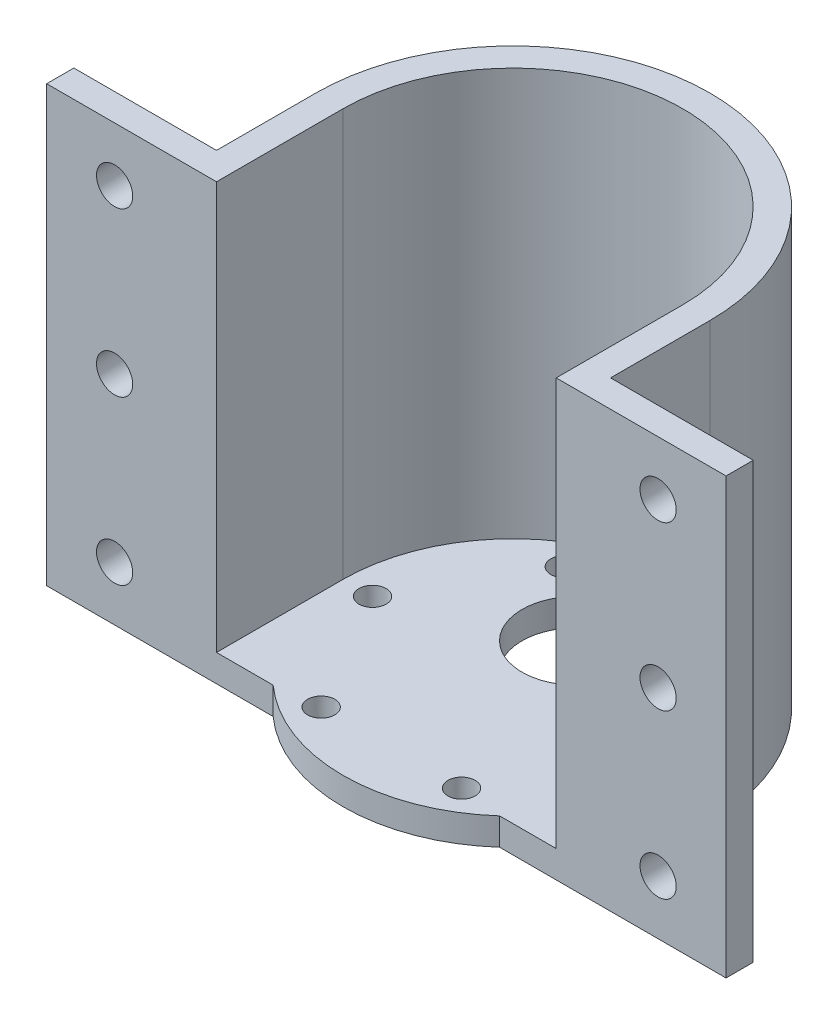
ISO-10303-21;
HEADER;
FILE_DESCRIPTION(('STEP AP214'),'2;1');
FILE_NAME('part.step','',(''),(''),'','','');
FILE_SCHEMA(('AUTOMOTIVE_DESIGN { 1 0 10303 214 1 1 1 1 }'));
ENDSEC;
DATA;
#1=APPLICATION_CONTEXT('core data for automotive mechanical design processes');
#2=APPLICATION_PROTOCOL_DEFINITION('international standard','automotive_design',2000,#1);
#3=PRODUCT_CONTEXT('',#1,'mechanical');
#4=PRODUCT('Part','Part','',(#3));
#5=PRODUCT_RELATED_PRODUCT_CATEGORY('part','',(#4));
#6=PRODUCT_DEFINITION_FORMATION('','',#4);
#7=PRODUCT_DEFINITION_CONTEXT('part definition',#1,'design');
#8=PRODUCT_DEFINITION('design','',#6,#7);
#9=PRODUCT_DEFINITION_SHAPE('','',#8);
#10=(LENGTH_UNIT() NAMED_UNIT(*) SI_UNIT(.MILLI.,.METRE.));
#11=(NAMED_UNIT(*) PLANE_ANGLE_UNIT() SI_UNIT($,.RADIAN.));
#12=(NAMED_UNIT(*) SI_UNIT($,.STERADIAN.) SOLID_ANGLE_UNIT());
#13=UNCERTAINTY_MEASURE_WITH_UNIT(LENGTH_MEASURE(1.E-05),#10,'distance_accuracy_value','');
#14=(GEOMETRIC_REPRESENTATION_CONTEXT(3) GLOBAL_UNCERTAINTY_ASSIGNED_CONTEXT((#13)) GLOBAL_UNIT_ASSIGNED_CONTEXT((#10,
#11,#12)) REPRESENTATION_CONTEXT('',''));
#15=CARTESIAN_POINT('',(0.,0.,0.));
#16=DIRECTION('',(0.,0.,1.));
#17=DIRECTION('',(1.,0.,0.));
#18=AXIS2_PLACEMENT_3D('',#15,#16,#17);
#19=CARTESIAN_POINT('',(-12.5,48.,0.));
#20=DIRECTION('',(0.,0.,-1.));
#21=DIRECTION('',(-1.,0.,0.));
#22=AXIS2_PLACEMENT_3D('',#19,#20,#21);
#23=PLANE('',#22);
#24=CARTESIAN_POINT('',(-30.,6.,0.));
#25=DIRECTION('',(0.,0.,-1.));
#26=DIRECTION('',(-1.,0.,0.));
#27=AXIS2_PLACEMENT_3D('',#24,#25,#26);
#28=CIRCLE('',#27,2.);
#29=CARTESIAN_POINT('',(-32.,6.,0.));
#30=VERTEX_POINT('',#29);
#31=EDGE_CURVE('E291',#30,#30,#28,.T.);
#32=ORIENTED_EDGE('',*,*,#31,.T.);
#33=EDGE_LOOP('',(#32));
#34=FACE_BOUND('',#33,.T.);
#35=CARTESIAN_POINT('',(-30.,24.,0.));
#36=DIRECTION('',(0.,0.,-1.));
#37=DIRECTION('',(-1.,0.,0.));
#38=AXIS2_PLACEMENT_3D('',#35,#36,#37);
#39=CIRCLE('',#38,2.);
#40=CARTESIAN_POINT('',(-32.,24.,0.));
#41=VERTEX_POINT('',#40);
#42=EDGE_CURVE('E295',#41,#41,#39,.T.);
#43=ORIENTED_EDGE('',*,*,#42,.T.);
#44=EDGE_LOOP('',(#43));
#45=FACE_BOUND('',#44,.T.);
#46=CARTESIAN_POINT('',(-30.,42.,0.));
#47=DIRECTION('',(0.,0.,-1.));
#48=DIRECTION('',(-1.,0.,0.));
#49=AXIS2_PLACEMENT_3D('',#46,#47,#48);
#50=CIRCLE('',#49,2.);
#51=CARTESIAN_POINT('',(-32.,42.,0.));
#52=VERTEX_POINT('',#51);
#53=EDGE_CURVE('E298',#52,#52,#50,.T.);
#54=ORIENTED_EDGE('',*,*,#53,.T.);
#55=EDGE_LOOP('',(#54));
#56=FACE_BOUND('',#55,.T.);
#57=DIRECTION('',(0.,-1.,0.));
#58=VECTOR('',#57,1.);
#59=CARTESIAN_POINT('',(-18.75,230.278179267603,0.));
#60=LINE('',#59,#58);
#61=CARTESIAN_POINT('',(-18.75,48.,0.));
#62=VERTEX_POINT('',#61);
#63=CARTESIAN_POINT('',(-18.75,3.,0.));
#64=VERTEX_POINT('',#63);
#65=EDGE_CURVE('E166',#62,#64,#60,.T.);
#66=ORIENTED_EDGE('',*,*,#65,.F.);
#67=DIRECTION('',(1.,0.,0.));
#68=VECTOR('',#67,1.);
#69=CARTESIAN_POINT('',(-12.5,48.,0.));
#70=LINE('',#69,#68);
#71=CARTESIAN_POINT('',(-37.5,48.,0.));
#72=VERTEX_POINT('',#71);
#73=EDGE_CURVE('E146',#72,#62,#70,.T.);
#74=ORIENTED_EDGE('',*,*,#73,.F.);
#75=DIRECTION('',(0.,-1.,0.));
#76=VECTOR('',#75,1.);
#77=CARTESIAN_POINT('',(-37.5,48.,0.));
#78=LINE('',#77,#76);
#79=CARTESIAN_POINT('',(-37.5,0.,0.));
#80=VERTEX_POINT('',#79);
#81=EDGE_CURVE('E196',#72,#80,#78,.T.);
#82=ORIENTED_EDGE('',*,*,#81,.T.);
#83=DIRECTION('',(1.,0.,0.));
#84=VECTOR('',#83,1.);
#85=CARTESIAN_POINT('',(-12.5,0.,0.));
#86=LINE('',#85,#84);
#87=CARTESIAN_POINT('',(-12.5,0.,0.));
#88=VERTEX_POINT('',#87);
#89=EDGE_CURVE('E165',#80,#88,#86,.T.);
#90=ORIENTED_EDGE('',*,*,#89,.T.);
#91=DIRECTION('',(0.,-1.,0.));
#92=VECTOR('',#91,1.);
#93=CARTESIAN_POINT('',(-12.5,48.,0.));
#94=LINE('',#93,#92);
#95=CARTESIAN_POINT('',(-12.5,3.,0.));
#96=VERTEX_POINT('',#95);
#97=EDGE_CURVE('E11',#96,#88,#94,.T.);
#98=ORIENTED_EDGE('',*,*,#97,.F.);
#99=DIRECTION('',(1.,0.,0.));
#100=VECTOR('',#99,1.);
#101=CARTESIAN_POINT('',(-12.5,3.,0.));
#102=LINE('',#101,#100);
#103=EDGE_CURVE('E53',#64,#96,#102,.T.);
#104=ORIENTED_EDGE('',*,*,#103,.F.);
#105=EDGE_LOOP('',(#66,#74,#82,#90,#98,#104));
#106=FACE_BOUND('',#105,.T.);
#107=ADVANCED_FACE('F37',(#34,#45,#56,#106),#23,.F.);
#108=CARTESIAN_POINT('',(0.,48.,-13.9754248593737));
#109=DIRECTION('',(0.,-1.,0.));
#110=DIRECTION('',(0.,0.,-1.));
#111=AXIS2_PLACEMENT_3D('',#108,#109,#110);
#112=CYLINDRICAL_SURFACE('',#111,18.75);
#113=CARTESIAN_POINT('',(0.,3.,-13.9754248593737));
#114=DIRECTION('',(0.,1.,0.));
#115=DIRECTION('',(0.,0.,1.));
#116=AXIS2_PLACEMENT_3D('',#113,#114,#115);
#117=CIRCLE('',#116,18.75);
#118=CARTESIAN_POINT('',(12.5,3.,0.));
#119=VERTEX_POINT('',#118);
#120=EDGE_CURVE('E175',#96,#119,#117,.T.);
#121=ORIENTED_EDGE('',*,*,#120,.F.);
#122=ORIENTED_EDGE('',*,*,#97,.T.);
#123=CARTESIAN_POINT('',(0.,0.,-13.9754248593737));
#124=DIRECTION('',(0.,1.,0.));
#125=DIRECTION('',(0.,0.,1.));
#126=AXIS2_PLACEMENT_3D('',#123,#124,#125);
#127=CIRCLE('',#126,18.75);
#128=CARTESIAN_POINT('',(12.5,0.,0.));
#129=VERTEX_POINT('',#128);
#130=EDGE_CURVE('E169',#88,#129,#127,.T.);
#131=ORIENTED_EDGE('',*,*,#130,.T.);
#132=DIRECTION('',(0.,-1.,0.));
#133=VECTOR('',#132,1.);
#134=CARTESIAN_POINT('',(12.5,48.,0.));
#135=LINE('',#134,#133);
#136=EDGE_CURVE('E45',#119,#129,#135,.T.);
#137=ORIENTED_EDGE('',*,*,#136,.F.);
#138=EDGE_LOOP('',(#121,#122,#131,#137));
#139=FACE_BOUND('',#138,.T.);
#140=ADVANCED_FACE('F282',(#139),#112,.T.);
#141=CARTESIAN_POINT('',(0.,48.,-13.9754248593737));
#142=DIRECTION('',(0.,-1.,0.));
#143=DIRECTION('',(0.,0.,-1.));
#144=AXIS2_PLACEMENT_3D('',#141,#142,#143);
#145=PLANE('',#144);
#146=ORIENTED_EDGE('',*,*,#73,.T.);
#147=DIRECTION('',(0.,0.,-1.));
#148=VECTOR('',#147,1.);
#149=CARTESIAN_POINT('',(-18.75,48.,-13.9754248593737));
#150=LINE('',#149,#148);
#151=CARTESIAN_POINT('',(-18.75,48.,-13.9754248593737));
#152=VERTEX_POINT('',#151);
#153=EDGE_CURVE('E140',#62,#152,#150,.T.);
#154=ORIENTED_EDGE('',*,*,#153,.T.);
#155=CARTESIAN_POINT('',(0.,48.,-13.9754248593737));
#156=DIRECTION('',(0.,-1.,0.));
#157=DIRECTION('',(0.,0.,-1.));
#158=AXIS2_PLACEMENT_3D('',#155,#156,#157);
#159=CIRCLE('',#158,18.75);
#160=CARTESIAN_POINT('',(18.75,48.,-13.9754248593737));
#161=VERTEX_POINT('',#160);
#162=EDGE_CURVE('E143',#152,#161,#159,.T.);
#163=ORIENTED_EDGE('',*,*,#162,.T.);
#164=DIRECTION('',(0.,0.,1.));
#165=VECTOR('',#164,1.);
#166=CARTESIAN_POINT('',(18.75,48.,-13.9754248593737));
#167=LINE('',#166,#165);
#168=CARTESIAN_POINT('',(18.75,48.,0.));
#169=VERTEX_POINT('',#168);
#170=EDGE_CURVE('E160',#161,#169,#167,.T.);
#171=ORIENTED_EDGE('',*,*,#170,.T.);
#172=DIRECTION('',(1.,0.,0.));
#173=VECTOR('',#172,1.);
#174=CARTESIAN_POINT('',(37.5,48.,0.));
#175=LINE('',#174,#173);
#176=CARTESIAN_POINT('',(37.5,48.,0.));
#177=VERTEX_POINT('',#176);
#178=EDGE_CURVE('E180',#169,#177,#175,.T.);
#179=ORIENTED_EDGE('',*,*,#178,.T.);
#180=DIRECTION('',(0.,0.,-1.));
#181=VECTOR('',#180,1.);
#182=CARTESIAN_POINT('',(37.5,48.,0.));
#183=LINE('',#182,#181);
#184=CARTESIAN_POINT('',(37.5,48.,-2.99999999999999));
#185=VERTEX_POINT('',#184);
#186=EDGE_CURVE('E183',#177,#185,#183,.T.);
#187=ORIENTED_EDGE('',*,*,#186,.T.);
#188=DIRECTION('',(-1.,0.,0.));
#189=VECTOR('',#188,1.);
#190=CARTESIAN_POINT('',(37.5,48.,-2.99999999999999));
#191=LINE('',#190,#189);
#192=CARTESIAN_POINT('',(21.75,48.,-2.99999999999999));
#193=VERTEX_POINT('',#192);
#194=EDGE_CURVE('E185',#185,#193,#191,.T.);
#195=ORIENTED_EDGE('',*,*,#194,.T.);
#196=DIRECTION('',(0.,0.,-1.));
#197=VECTOR('',#196,1.);
#198=CARTESIAN_POINT('',(21.75,48.,-2.99999999999999));
#199=LINE('',#198,#197);
#200=CARTESIAN_POINT('',(21.75,48.,-13.9754248593737));
#201=VERTEX_POINT('',#200);
#202=EDGE_CURVE('E187',#193,#201,#199,.T.);
#203=ORIENTED_EDGE('',*,*,#202,.T.);
#204=CARTESIAN_POINT('',(0.,48.,-13.9754248593737));
#205=DIRECTION('',(0.,1.,0.));
#206=DIRECTION('',(0.,0.,-1.));
#207=AXIS2_PLACEMENT_3D('',#204,#205,#206);
#208=CIRCLE('',#207,21.75);
#209=CARTESIAN_POINT('',(-21.75,48.,-13.9754248593737));
#210=VERTEX_POINT('',#209);
#211=EDGE_CURVE('E189',#201,#210,#208,.T.);
#212=ORIENTED_EDGE('',*,*,#211,.T.);
#213=DIRECTION('',(0.,0.,1.));
#214=VECTOR('',#213,1.);
#215=CARTESIAN_POINT('',(-21.75,48.,-2.99999999999999));
#216=LINE('',#215,#214);
#217=CARTESIAN_POINT('',(-21.75,48.,-2.99999999999999));
#218=VERTEX_POINT('',#217);
#219=EDGE_CURVE('E191',#210,#218,#216,.T.);
#220=ORIENTED_EDGE('',*,*,#219,.T.);
#221=DIRECTION('',(-1.,0.,0.));
#222=VECTOR('',#221,1.);
#223=CARTESIAN_POINT('',(-37.5,48.,-2.99999999999999));
#224=LINE('',#223,#222);
#225=CARTESIAN_POINT('',(-37.5,48.,-2.99999999999999));
#226=VERTEX_POINT('',#225);
#227=EDGE_CURVE('E193',#218,#226,#224,.T.);
#228=ORIENTED_EDGE('',*,*,#227,.T.);
#229=DIRECTION('',(0.,0.,1.));
#230=VECTOR('',#229,1.);
#231=CARTESIAN_POINT('',(-37.5,48.,0.));
#232=LINE('',#231,#230);
#233=EDGE_CURVE('E195',#226,#72,#232,.T.);
#234=ORIENTED_EDGE('',*,*,#233,.T.);
#235=EDGE_LOOP('',(#146,#154,#163,#171,#179,#187,#195,#203,#212,#220,#228,#234));
#236=FACE_BOUND('',#235,.T.);
#237=ADVANCED_FACE('F142',(#236),#145,.F.);
#238=CARTESIAN_POINT('',(37.5,48.,0.));
#239=DIRECTION('',(0.,0.,-1.));
#240=DIRECTION('',(-1.,0.,0.));
#241=AXIS2_PLACEMENT_3D('',#238,#239,#240);
#242=PLANE('',#241);
#243=CARTESIAN_POINT('',(30.,24.,0.));
#244=DIRECTION('',(0.,0.,-1.));
#245=DIRECTION('',(-1.,0.,0.));
#246=AXIS2_PLACEMENT_3D('',#243,#244,#245);
#247=CIRCLE('',#246,2.);
#248=CARTESIAN_POINT('',(28.,24.,0.));
#249=VERTEX_POINT('',#248);
#250=EDGE_CURVE('E386',#249,#249,#247,.T.);
#251=ORIENTED_EDGE('',*,*,#250,.T.);
#252=EDGE_LOOP('',(#251));
#253=FACE_BOUND('',#252,.T.);
#254=CARTESIAN_POINT('',(30.,42.,0.));
#255=DIRECTION('',(0.,0.,-1.));
#256=DIRECTION('',(-1.,0.,0.));
#257=AXIS2_PLACEMENT_3D('',#254,#255,#256);
#258=CIRCLE('',#257,2.);
#259=CARTESIAN_POINT('',(28.,42.,0.));
#260=VERTEX_POINT('',#259);
#261=EDGE_CURVE('E390',#260,#260,#258,.T.);
#262=ORIENTED_EDGE('',*,*,#261,.T.);
#263=EDGE_LOOP('',(#262));
#264=FACE_BOUND('',#263,.T.);
#265=CARTESIAN_POINT('',(30.,6.,0.));
#266=DIRECTION('',(0.,0.,-1.));
#267=DIRECTION('',(-1.,0.,0.));
#268=AXIS2_PLACEMENT_3D('',#265,#266,#267);
#269=CIRCLE('',#268,2.);
#270=CARTESIAN_POINT('',(28.,6.,0.));
#271=VERTEX_POINT('',#270);
#272=EDGE_CURVE('E393',#271,#271,#269,.T.);
#273=ORIENTED_EDGE('',*,*,#272,.T.);
#274=EDGE_LOOP('',(#273));
#275=FACE_BOUND('',#274,.T.);
#276=ORIENTED_EDGE('',*,*,#178,.F.);
#277=DIRECTION('',(0.,-1.,0.));
#278=VECTOR('',#277,1.);
#279=CARTESIAN_POINT('',(18.75,230.278179267603,0.));
#280=LINE('',#279,#278);
#281=CARTESIAN_POINT('',(18.75,3.,0.));
#282=VERTEX_POINT('',#281);
#283=EDGE_CURVE('E61',#169,#282,#280,.T.);
#284=ORIENTED_EDGE('',*,*,#283,.T.);
#285=DIRECTION('',(1.,0.,0.));
#286=VECTOR('',#285,1.);
#287=CARTESIAN_POINT('',(37.5,3.,0.));
#288=LINE('',#287,#286);
#289=EDGE_CURVE('E150',#119,#282,#288,.T.);
#290=ORIENTED_EDGE('',*,*,#289,.F.);
#291=ORIENTED_EDGE('',*,*,#136,.T.);
#292=DIRECTION('',(1.,0.,0.));
#293=VECTOR('',#292,1.);
#294=CARTESIAN_POINT('',(37.5,0.,0.));
#295=LINE('',#294,#293);
#296=CARTESIAN_POINT('',(37.5,0.,0.));
#297=VERTEX_POINT('',#296);
#298=EDGE_CURVE('E200',#129,#297,#295,.T.);
#299=ORIENTED_EDGE('',*,*,#298,.T.);
#300=DIRECTION('',(0.,-1.,0.));
#301=VECTOR('',#300,1.);
#302=CARTESIAN_POINT('',(37.5,48.,0.));
#303=LINE('',#302,#301);
#304=EDGE_CURVE('E235',#177,#297,#303,.T.);
#305=ORIENTED_EDGE('',*,*,#304,.F.);
#306=EDGE_LOOP('',(#276,#284,#290,#291,#299,#305));
#307=FACE_BOUND('',#306,.T.);
#308=ADVANCED_FACE('F325',(#253,#264,#275,#307),#242,.F.);
#309=CARTESIAN_POINT('',(37.5,48.,0.));
#310=DIRECTION('',(-1.,0.,0.));
#311=DIRECTION('',(0.,0.,1.));
#312=AXIS2_PLACEMENT_3D('',#309,#310,#311);
#313=PLANE('',#312);
#314=DIRECTION('',(0.,0.,-1.));
#315=VECTOR('',#314,1.);
#316=CARTESIAN_POINT('',(37.5,0.,0.));
#317=LINE('',#316,#315);
#318=CARTESIAN_POINT('',(37.5,0.,-2.99999999999999));
#319=VERTEX_POINT('',#318);
#320=EDGE_CURVE('E202',#297,#319,#317,.T.);
#321=ORIENTED_EDGE('',*,*,#320,.T.);
#322=DIRECTION('',(0.,-1.,0.));
#323=VECTOR('',#322,1.);
#324=CARTESIAN_POINT('',(37.5,48.,-2.99999999999999));
#325=LINE('',#324,#323);
#326=EDGE_CURVE('E232',#185,#319,#325,.T.);
#327=ORIENTED_EDGE('',*,*,#326,.F.);
#328=ORIENTED_EDGE('',*,*,#186,.F.);
#329=ORIENTED_EDGE('',*,*,#304,.T.);
#330=EDGE_LOOP('',(#321,#327,#328,#329));
#331=FACE_BOUND('',#330,.T.);
#332=ADVANCED_FACE('F329',(#331),#313,.F.);
#333=CARTESIAN_POINT('',(37.5,48.,-2.99999999999999));
#334=DIRECTION('',(0.,0.,1.));
#335=DIRECTION('',(1.,0.,0.));
#336=AXIS2_PLACEMENT_3D('',#333,#334,#335);
#337=PLANE('',#336);
#338=CARTESIAN_POINT('',(30.,24.,-2.99999999999999));
#339=DIRECTION('',(0.,0.,-1.));
#340=DIRECTION('',(-1.,0.,0.));
#341=AXIS2_PLACEMENT_3D('',#338,#339,#340);
#342=CIRCLE('',#341,2.);
#343=CARTESIAN_POINT('',(28.,24.,-2.99999999999999));
#344=VERTEX_POINT('',#343);
#345=EDGE_CURVE('E705',#344,#344,#342,.T.);
#346=ORIENTED_EDGE('',*,*,#345,.F.);
#347=EDGE_LOOP('',(#346));
#348=FACE_BOUND('',#347,.T.);
#349=CARTESIAN_POINT('',(30.,42.,-2.99999999999999));
#350=DIRECTION('',(0.,0.,-1.));
#351=DIRECTION('',(-1.,0.,0.));
#352=AXIS2_PLACEMENT_3D('',#349,#350,#351);
#353=CIRCLE('',#352,2.);
#354=CARTESIAN_POINT('',(28.,42.,-2.99999999999999));
#355=VERTEX_POINT('',#354);
#356=EDGE_CURVE('E707',#355,#355,#353,.T.);
#357=ORIENTED_EDGE('',*,*,#356,.F.);
#358=EDGE_LOOP('',(#357));
#359=FACE_BOUND('',#358,.T.);
#360=CARTESIAN_POINT('',(30.,6.,-2.99999999999999));
#361=DIRECTION('',(0.,0.,-1.));
#362=DIRECTION('',(-1.,0.,0.));
#363=AXIS2_PLACEMENT_3D('',#360,#361,#362);
#364=CIRCLE('',#363,2.);
#365=CARTESIAN_POINT('',(28.,6.,-2.99999999999999));
#366=VERTEX_POINT('',#365);
#367=EDGE_CURVE('E706',#366,#366,#364,.T.);
#368=ORIENTED_EDGE('',*,*,#367,.F.);
#369=EDGE_LOOP('',(#368));
#370=FACE_BOUND('',#369,.T.);
#371=DIRECTION('',(-1.,0.,0.));
#372=VECTOR('',#371,1.);
#373=CARTESIAN_POINT('',(37.5,0.,-2.99999999999999));
#374=LINE('',#373,#372);
#375=CARTESIAN_POINT('',(21.75,0.,-2.99999999999999));
#376=VERTEX_POINT('',#375);
#377=EDGE_CURVE('E204',#319,#376,#374,.T.);
#378=ORIENTED_EDGE('',*,*,#377,.T.);
#379=DIRECTION('',(0.,-1.,0.));
#380=VECTOR('',#379,1.);
#381=CARTESIAN_POINT('',(21.75,48.,-2.99999999999999));
#382=LINE('',#381,#380);
#383=EDGE_CURVE('E229',#193,#376,#382,.T.);
#384=ORIENTED_EDGE('',*,*,#383,.F.);
#385=ORIENTED_EDGE('',*,*,#194,.F.);
#386=ORIENTED_EDGE('',*,*,#326,.T.);
#387=EDGE_LOOP('',(#378,#384,#385,#386));
#388=FACE_BOUND('',#387,.T.);
#389=ADVANCED_FACE('F335',(#348,#359,#370,#388),#337,.F.);
#390=CARTESIAN_POINT('',(21.75,48.,-2.99999999999999));
#391=DIRECTION('',(-1.,0.,0.));
#392=DIRECTION('',(0.,0.,1.));
#393=AXIS2_PLACEMENT_3D('',#390,#391,#392);
#394=PLANE('',#393);
#395=DIRECTION('',(0.,0.,-1.));
#396=VECTOR('',#395,1.);
#397=CARTESIAN_POINT('',(21.75,0.,-2.99999999999999));
#398=LINE('',#397,#396);
#399=CARTESIAN_POINT('',(21.75,0.,-13.9754248593737));
#400=VERTEX_POINT('',#399);
#401=EDGE_CURVE('E206',#376,#400,#398,.T.);
#402=ORIENTED_EDGE('',*,*,#401,.T.);
#403=DIRECTION('',(0.,-1.,0.));
#404=VECTOR('',#403,1.);
#405=CARTESIAN_POINT('',(21.75,48.,-13.9754248593737));
#406=LINE('',#405,#404);
#407=EDGE_CURVE('E226',#201,#400,#406,.T.);
#408=ORIENTED_EDGE('',*,*,#407,.F.);
#409=ORIENTED_EDGE('',*,*,#202,.F.);
#410=ORIENTED_EDGE('',*,*,#383,.T.);
#411=EDGE_LOOP('',(#402,#408,#409,#410));
#412=FACE_BOUND('',#411,.T.);
#413=ADVANCED_FACE('F339',(#412),#394,.F.);
#414=CARTESIAN_POINT('',(0.,48.,-13.9754248593737));
#415=DIRECTION('',(0.,-1.,0.));
#416=DIRECTION('',(0.,0.,-1.));
#417=AXIS2_PLACEMENT_3D('',#414,#415,#416);
#418=CYLINDRICAL_SURFACE('',#417,21.75);
#419=CARTESIAN_POINT('',(0.,0.,-13.9754248593737));
#420=DIRECTION('',(0.,1.,0.));
#421=DIRECTION('',(0.,0.,-1.));
#422=AXIS2_PLACEMENT_3D('',#419,#420,#421);
#423=CIRCLE('',#422,21.75);
#424=CARTESIAN_POINT('',(-21.75,0.,-13.9754248593737));
#425=VERTEX_POINT('',#424);
#426=EDGE_CURVE('E208',#400,#425,#423,.T.);
#427=ORIENTED_EDGE('',*,*,#426,.T.);
#428=DIRECTION('',(0.,-1.,0.));
#429=VECTOR('',#428,1.);
#430=CARTESIAN_POINT('',(-21.75,48.,-13.9754248593737));
#431=LINE('',#430,#429);
#432=EDGE_CURVE('E223',#210,#425,#431,.T.);
#433=ORIENTED_EDGE('',*,*,#432,.F.);
#434=ORIENTED_EDGE('',*,*,#211,.F.);
#435=ORIENTED_EDGE('',*,*,#407,.T.);
#436=EDGE_LOOP('',(#427,#433,#434,#435));
#437=FACE_BOUND('',#436,.T.);
#438=ADVANCED_FACE('F344',(#437),#418,.T.);
#439=CARTESIAN_POINT('',(-21.75,48.,-2.99999999999999));
#440=DIRECTION('',(1.,0.,0.));
#441=DIRECTION('',(0.,0.,-1.));
#442=AXIS2_PLACEMENT_3D('',#439,#440,#441);
#443=PLANE('',#442);
#444=DIRECTION('',(0.,0.,1.));
#445=VECTOR('',#444,1.);
#446=CARTESIAN_POINT('',(-21.75,0.,-2.99999999999999));
#447=LINE('',#446,#445);
#448=CARTESIAN_POINT('',(-21.75,0.,-2.99999999999999));
#449=VERTEX_POINT('',#448);
#450=EDGE_CURVE('E210',#425,#449,#447,.T.);
#451=ORIENTED_EDGE('',*,*,#450,.T.);
#452=DIRECTION('',(0.,-1.,0.));
#453=VECTOR('',#452,1.);
#454=CARTESIAN_POINT('',(-21.75,48.,-2.99999999999999));
#455=LINE('',#454,#453);
#456=EDGE_CURVE('E220',#218,#449,#455,.T.);
#457=ORIENTED_EDGE('',*,*,#456,.F.);
#458=ORIENTED_EDGE('',*,*,#219,.F.);
#459=ORIENTED_EDGE('',*,*,#432,.T.);
#460=EDGE_LOOP('',(#451,#457,#458,#459));
#461=FACE_BOUND('',#460,.T.);
#462=ADVANCED_FACE('F350',(#461),#443,.F.);
#463=CARTESIAN_POINT('',(-37.5,48.,-2.99999999999999));
#464=DIRECTION('',(0.,0.,1.));
#465=DIRECTION('',(1.,0.,0.));
#466=AXIS2_PLACEMENT_3D('',#463,#464,#465);
#467=PLANE('',#466);
#468=CARTESIAN_POINT('',(-30.,6.,-2.99999999999999));
#469=DIRECTION('',(0.,0.,-1.));
#470=DIRECTION('',(1.,0.,0.));
#471=AXIS2_PLACEMENT_3D('',#468,#469,#470);
#472=CIRCLE('',#471,2.);
#473=CARTESIAN_POINT('',(-28.,6.,-2.99999999999999));
#474=VERTEX_POINT('',#473);
#475=EDGE_CURVE('E712',#474,#474,#472,.T.);
#476=ORIENTED_EDGE('',*,*,#475,.F.);
#477=EDGE_LOOP('',(#476));
#478=FACE_BOUND('',#477,.T.);
#479=CARTESIAN_POINT('',(-30.,24.,-2.99999999999999));
#480=DIRECTION('',(0.,0.,-1.));
#481=DIRECTION('',(1.,0.,0.));
#482=AXIS2_PLACEMENT_3D('',#479,#480,#481);
#483=CIRCLE('',#482,2.);
#484=CARTESIAN_POINT('',(-28.,24.,-2.99999999999999));
#485=VERTEX_POINT('',#484);
#486=EDGE_CURVE('E719',#485,#485,#483,.T.);
#487=ORIENTED_EDGE('',*,*,#486,.F.);
#488=EDGE_LOOP('',(#487));
#489=FACE_BOUND('',#488,.T.);
#490=CARTESIAN_POINT('',(-30.,42.,-2.99999999999999));
#491=DIRECTION('',(0.,0.,-1.));
#492=DIRECTION('',(1.,0.,0.));
#493=AXIS2_PLACEMENT_3D('',#490,#491,#492);
#494=CIRCLE('',#493,2.);
#495=CARTESIAN_POINT('',(-28.,42.,-2.99999999999999));
#496=VERTEX_POINT('',#495);
#497=EDGE_CURVE('E715',#496,#496,#494,.T.);
#498=ORIENTED_EDGE('',*,*,#497,.F.);
#499=EDGE_LOOP('',(#498));
#500=FACE_BOUND('',#499,.T.);
#501=DIRECTION('',(-1.,0.,0.));
#502=VECTOR('',#501,1.);
#503=CARTESIAN_POINT('',(-37.5,0.,-2.99999999999999));
#504=LINE('',#503,#502);
#505=CARTESIAN_POINT('',(-37.5,0.,-2.99999999999999));
#506=VERTEX_POINT('',#505);
#507=EDGE_CURVE('E212',#449,#506,#504,.T.);
#508=ORIENTED_EDGE('',*,*,#507,.T.);
#509=DIRECTION('',(0.,-1.,0.));
#510=VECTOR('',#509,1.);
#511=CARTESIAN_POINT('',(-37.5,48.,-2.99999999999999));
#512=LINE('',#511,#510);
#513=EDGE_CURVE('E217',#226,#506,#512,.T.);
#514=ORIENTED_EDGE('',*,*,#513,.F.);
#515=ORIENTED_EDGE('',*,*,#227,.F.);
#516=ORIENTED_EDGE('',*,*,#456,.T.);
#517=EDGE_LOOP('',(#508,#514,#515,#516));
#518=FACE_BOUND('',#517,.T.);
#519=ADVANCED_FACE('F353',(#478,#489,#500,#518),#467,.F.);
#520=CARTESIAN_POINT('',(-37.5,48.,0.));
#521=DIRECTION('',(1.,0.,0.));
#522=DIRECTION('',(0.,0.,-1.));
#523=AXIS2_PLACEMENT_3D('',#520,#521,#522);
#524=PLANE('',#523);
#525=DIRECTION('',(0.,0.,1.));
#526=VECTOR('',#525,1.);
#527=CARTESIAN_POINT('',(-37.5,0.,0.));
#528=LINE('',#527,#526);
#529=EDGE_CURVE('E181',#506,#80,#528,.T.);
#530=ORIENTED_EDGE('',*,*,#529,.T.);
#531=ORIENTED_EDGE('',*,*,#81,.F.);
#532=ORIENTED_EDGE('',*,*,#233,.F.);
#533=ORIENTED_EDGE('',*,*,#513,.T.);
#534=EDGE_LOOP('',(#530,#531,#532,#533));
#535=FACE_BOUND('',#534,.T.);
#536=ADVANCED_FACE('F354',(#535),#524,.F.);
#537=CARTESIAN_POINT('',(0.,0.,-13.9754248593737));
#538=DIRECTION('',(0.,-1.,0.));
#539=DIRECTION('',(0.,0.,-1.));
#540=AXIS2_PLACEMENT_3D('',#537,#538,#539);
#541=PLANE('',#540);
#542=CARTESIAN_POINT('',(7.74999999999999,0.,-0.552031100714875));
#543=DIRECTION('',(0.,-1.,0.));
#544=DIRECTION('',(0.,0.,-1.));
#545=AXIS2_PLACEMENT_3D('',#542,#543,#544);
#546=CIRCLE('',#545,1.5);
#547=CARTESIAN_POINT('',(7.74999999999999,0.,-2.05203110071487));
#548=VERTEX_POINT('',#547);
#549=EDGE_CURVE('E401',#548,#548,#546,.T.);
#550=ORIENTED_EDGE('',*,*,#549,.F.);
#551=EDGE_LOOP('',(#550));
#552=FACE_BOUND('',#551,.T.);
#553=CARTESIAN_POINT('',(-7.75000000000001,0.,-0.552031100714882));
#554=DIRECTION('',(0.,-1.,0.));
#555=DIRECTION('',(0.,0.,-1.));
#556=AXIS2_PLACEMENT_3D('',#553,#554,#555);
#557=CIRCLE('',#556,1.5);
#558=CARTESIAN_POINT('',(-7.75000000000001,0.,-2.05203110071488));
#559=VERTEX_POINT('',#558);
#560=EDGE_CURVE('E414',#559,#559,#557,.T.);
#561=ORIENTED_EDGE('',*,*,#560,.F.);
#562=EDGE_LOOP('',(#561));
#563=FACE_BOUND('',#562,.T.);
#564=CARTESIAN_POINT('',(-15.5,0.,-13.9754248593737));
#565=DIRECTION('',(0.,-1.,0.));
#566=DIRECTION('',(0.,0.,-1.));
#567=AXIS2_PLACEMENT_3D('',#564,#565,#566);
#568=CIRCLE('',#567,1.5);
#569=CARTESIAN_POINT('',(-15.5,0.,-15.4754248593737));
#570=VERTEX_POINT('',#569);
#571=EDGE_CURVE('E411',#570,#570,#568,.T.);
#572=ORIENTED_EDGE('',*,*,#571,.F.);
#573=EDGE_LOOP('',(#572));
#574=FACE_BOUND('',#573,.T.);
#575=CARTESIAN_POINT('',(-7.75,0.,-27.3988186180325));
#576=DIRECTION('',(0.,-1.,0.));
#577=DIRECTION('',(0.,0.,-1.));
#578=AXIS2_PLACEMENT_3D('',#575,#576,#577);
#579=CIRCLE('',#578,1.5);
#580=CARTESIAN_POINT('',(-7.75,0.,-28.8988186180325));
#581=VERTEX_POINT('',#580);
#582=EDGE_CURVE('E408',#581,#581,#579,.T.);
#583=ORIENTED_EDGE('',*,*,#582,.F.);
#584=EDGE_LOOP('',(#583));
#585=FACE_BOUND('',#584,.T.);
#586=CARTESIAN_POINT('',(7.75,0.,-27.3988186180325));
#587=DIRECTION('',(0.,-1.,0.));
#588=DIRECTION('',(0.,0.,-1.));
#589=AXIS2_PLACEMENT_3D('',#586,#587,#588);
#590=CIRCLE('',#589,1.5);
#591=CARTESIAN_POINT('',(7.75,0.,-28.8988186180325));
#592=VERTEX_POINT('',#591);
#593=EDGE_CURVE('E405',#592,#592,#590,.T.);
#594=ORIENTED_EDGE('',*,*,#593,.F.);
#595=EDGE_LOOP('',(#594));
#596=FACE_BOUND('',#595,.T.);
#597=CARTESIAN_POINT('',(15.5,0.,-13.9754248593737));
#598=DIRECTION('',(0.,-1.,0.));
#599=DIRECTION('',(0.,0.,-1.));
#600=AXIS2_PLACEMENT_3D('',#597,#598,#599);
#601=CIRCLE('',#600,1.5);
#602=CARTESIAN_POINT('',(15.5,0.,-15.4754248593737));
#603=VERTEX_POINT('',#602);
#604=EDGE_CURVE('E402',#603,#603,#601,.T.);
#605=ORIENTED_EDGE('',*,*,#604,.F.);
#606=EDGE_LOOP('',(#605));
#607=FACE_BOUND('',#606,.T.);
#608=CARTESIAN_POINT('',(0.,0.,-20.9754248593737));
#609=DIRECTION('',(0.,-1.,0.));
#610=DIRECTION('',(0.,0.,-1.));
#611=AXIS2_PLACEMENT_3D('',#608,#609,#610);
#612=CIRCLE('',#611,6.);
#613=CARTESIAN_POINT('',(0.,0.,-26.9754248593737));
#614=VERTEX_POINT('',#613);
#615=EDGE_CURVE('E243',#614,#614,#612,.T.);
#616=ORIENTED_EDGE('',*,*,#615,.F.);
#617=EDGE_LOOP('',(#616));
#618=FACE_BOUND('',#617,.T.);
#619=ORIENTED_EDGE('',*,*,#89,.F.);
#620=ORIENTED_EDGE('',*,*,#529,.F.);
#621=ORIENTED_EDGE('',*,*,#507,.F.);
#622=ORIENTED_EDGE('',*,*,#450,.F.);
#623=ORIENTED_EDGE('',*,*,#426,.F.);
#624=ORIENTED_EDGE('',*,*,#401,.F.);
#625=ORIENTED_EDGE('',*,*,#377,.F.);
#626=ORIENTED_EDGE('',*,*,#320,.F.);
#627=ORIENTED_EDGE('',*,*,#298,.F.);
#628=ORIENTED_EDGE('',*,*,#130,.F.);
#629=EDGE_LOOP('',(#619,#620,#621,#622,#623,#624,#625,#626,#627,#628));
#630=FACE_BOUND('',#629,.T.);
#631=ADVANCED_FACE('F306',(#552,#563,#574,#585,#596,#607,#618,#630),#541,.T.);
#632=CARTESIAN_POINT('',(-18.75,230.278179267603,-13.9754248593737));
#633=DIRECTION('',(1.,0.,0.));
#634=DIRECTION('',(0.,0.,-1.));
#635=AXIS2_PLACEMENT_3D('',#632,#633,#634);
#636=PLANE('',#635);
#637=ORIENTED_EDGE('',*,*,#153,.F.);
#638=ORIENTED_EDGE('',*,*,#65,.T.);
#639=DIRECTION('',(0.,0.,-1.));
#640=VECTOR('',#639,1.);
#641=CARTESIAN_POINT('',(-18.75,3.,-13.9754248593737));
#642=LINE('',#641,#640);
#643=CARTESIAN_POINT('',(-18.75,3.,-13.9754248593737));
#644=VERTEX_POINT('',#643);
#645=EDGE_CURVE('E164',#64,#644,#642,.T.);
#646=ORIENTED_EDGE('',*,*,#645,.T.);
#647=DIRECTION('',(0.,-1.,0.));
#648=VECTOR('',#647,1.);
#649=CARTESIAN_POINT('',(-18.75,230.278179267603,-13.9754248593737));
#650=LINE('',#649,#648);
#651=EDGE_CURVE('E157',#152,#644,#650,.T.);
#652=ORIENTED_EDGE('',*,*,#651,.F.);
#653=EDGE_LOOP('',(#637,#638,#646,#652));
#654=FACE_BOUND('',#653,.T.);
#655=ADVANCED_FACE('F163',(#654),#636,.T.);
#656=CARTESIAN_POINT('',(0.,230.278179267603,-13.9754248593737));
#657=DIRECTION('',(0.,-1.,0.));
#658=DIRECTION('',(0.,0.,-1.));
#659=AXIS2_PLACEMENT_3D('',#656,#657,#658);
#660=CYLINDRICAL_SURFACE('',#659,18.75);
#661=ORIENTED_EDGE('',*,*,#162,.F.);
#662=ORIENTED_EDGE('',*,*,#651,.T.);
#663=CARTESIAN_POINT('',(0.,3.,-13.9754248593737));
#664=DIRECTION('',(0.,-1.,0.));
#665=DIRECTION('',(0.,0.,-1.));
#666=AXIS2_PLACEMENT_3D('',#663,#664,#665);
#667=CIRCLE('',#666,18.75);
#668=CARTESIAN_POINT('',(18.75,3.,-13.9754248593737));
#669=VERTEX_POINT('',#668);
#670=EDGE_CURVE('E312',#644,#669,#667,.T.);
#671=ORIENTED_EDGE('',*,*,#670,.T.);
#672=DIRECTION('',(0.,-1.,0.));
#673=VECTOR('',#672,1.);
#674=CARTESIAN_POINT('',(18.75,230.278179267603,-13.9754248593737));
#675=LINE('',#674,#673);
#676=EDGE_CURVE('E159',#161,#669,#675,.T.);
#677=ORIENTED_EDGE('',*,*,#676,.F.);
#678=EDGE_LOOP('',(#661,#662,#671,#677));
#679=FACE_BOUND('',#678,.T.);
#680=ADVANCED_FACE('F155',(#679),#660,.F.);
#681=CARTESIAN_POINT('',(18.75,230.278179267603,-13.9754248593737));
#682=DIRECTION('',(-1.,0.,0.));
#683=DIRECTION('',(0.,0.,1.));
#684=AXIS2_PLACEMENT_3D('',#681,#682,#683);
#685=PLANE('',#684);
#686=ORIENTED_EDGE('',*,*,#170,.F.);
#687=ORIENTED_EDGE('',*,*,#676,.T.);
#688=DIRECTION('',(0.,0.,1.));
#689=VECTOR('',#688,1.);
#690=CARTESIAN_POINT('',(18.75,3.,-13.9754248593737));
#691=LINE('',#690,#689);
#692=EDGE_CURVE('E315',#669,#282,#691,.T.);
#693=ORIENTED_EDGE('',*,*,#692,.T.);
#694=ORIENTED_EDGE('',*,*,#283,.F.);
#695=EDGE_LOOP('',(#686,#687,#693,#694));
#696=FACE_BOUND('',#695,.T.);
#697=ADVANCED_FACE('F323',(#696),#685,.T.);
#698=CARTESIAN_POINT('',(0.,3.,-13.9754248593737));
#699=DIRECTION('',(0.,-1.,0.));
#700=DIRECTION('',(0.,0.,-1.));
#701=AXIS2_PLACEMENT_3D('',#698,#699,#700);
#702=PLANE('',#701);
#703=CARTESIAN_POINT('',(7.74999999999999,3.,-0.552031100714875));
#704=DIRECTION('',(0.,-1.,0.));
#705=DIRECTION('',(0.,0.,-1.));
#706=AXIS2_PLACEMENT_3D('',#703,#704,#705);
#707=CIRCLE('',#706,1.5);
#708=CARTESIAN_POINT('',(7.74999999999999,3.,-2.05203110071487));
#709=VERTEX_POINT('',#708);
#710=EDGE_CURVE('E40',#709,#709,#707,.T.);
#711=ORIENTED_EDGE('',*,*,#710,.T.);
#712=EDGE_LOOP('',(#711));
#713=FACE_BOUND('',#712,.T.);
#714=CARTESIAN_POINT('',(-7.75000000000001,3.,-0.552031100714882));
#715=DIRECTION('',(0.,-1.,0.));
#716=DIRECTION('',(0.,0.,-1.));
#717=AXIS2_PLACEMENT_3D('',#714,#715,#716);
#718=CIRCLE('',#717,1.5);
#719=CARTESIAN_POINT('',(-7.75000000000001,3.,-2.05203110071488));
#720=VERTEX_POINT('',#719);
#721=EDGE_CURVE('E254',#720,#720,#718,.T.);
#722=ORIENTED_EDGE('',*,*,#721,.T.);
#723=EDGE_LOOP('',(#722));
#724=FACE_BOUND('',#723,.T.);
#725=CARTESIAN_POINT('',(-15.5,3.,-13.9754248593737));
#726=DIRECTION('',(0.,-1.,0.));
#727=DIRECTION('',(0.,0.,-1.));
#728=AXIS2_PLACEMENT_3D('',#725,#726,#727);
#729=CIRCLE('',#728,1.5);
#730=CARTESIAN_POINT('',(-15.5,3.,-15.4754248593737));
#731=VERTEX_POINT('',#730);
#732=EDGE_CURVE('E252',#731,#731,#729,.T.);
#733=ORIENTED_EDGE('',*,*,#732,.T.);
#734=EDGE_LOOP('',(#733));
#735=FACE_BOUND('',#734,.T.);
#736=CARTESIAN_POINT('',(-7.75,3.,-27.3988186180325));
#737=DIRECTION('',(0.,-1.,0.));
#738=DIRECTION('',(0.,0.,-1.));
#739=AXIS2_PLACEMENT_3D('',#736,#737,#738);
#740=CIRCLE('',#739,1.5);
#741=CARTESIAN_POINT('',(-7.75,3.,-28.8988186180325));
#742=VERTEX_POINT('',#741);
#743=EDGE_CURVE('E249',#742,#742,#740,.T.);
#744=ORIENTED_EDGE('',*,*,#743,.T.);
#745=EDGE_LOOP('',(#744));
#746=FACE_BOUND('',#745,.T.);
#747=CARTESIAN_POINT('',(7.75,3.,-27.3988186180325));
#748=DIRECTION('',(0.,-1.,0.));
#749=DIRECTION('',(0.,0.,-1.));
#750=AXIS2_PLACEMENT_3D('',#747,#748,#749);
#751=CIRCLE('',#750,1.5);
#752=CARTESIAN_POINT('',(7.75,3.,-28.8988186180325));
#753=VERTEX_POINT('',#752);
#754=EDGE_CURVE('E246',#753,#753,#751,.T.);
#755=ORIENTED_EDGE('',*,*,#754,.T.);
#756=EDGE_LOOP('',(#755));
#757=FACE_BOUND('',#756,.T.);
#758=CARTESIAN_POINT('',(15.5,3.,-13.9754248593737));
#759=DIRECTION('',(0.,-1.,0.));
#760=DIRECTION('',(0.,0.,-1.));
#761=AXIS2_PLACEMENT_3D('',#758,#759,#760);
#762=CIRCLE('',#761,1.5);
#763=CARTESIAN_POINT('',(15.5,3.,-15.4754248593737));
#764=VERTEX_POINT('',#763);
#765=EDGE_CURVE('E242',#764,#764,#762,.T.);
#766=ORIENTED_EDGE('',*,*,#765,.T.);
#767=EDGE_LOOP('',(#766));
#768=FACE_BOUND('',#767,.T.);
#769=CARTESIAN_POINT('',(0.,3.,-20.9754248593737));
#770=DIRECTION('',(0.,-1.,0.));
#771=DIRECTION('',(0.,0.,-1.));
#772=AXIS2_PLACEMENT_3D('',#769,#770,#771);
#773=CIRCLE('',#772,6.);
#774=CARTESIAN_POINT('',(0.,3.,-26.9754248593737));
#775=VERTEX_POINT('',#774);
#776=EDGE_CURVE('E239',#775,#775,#773,.T.);
#777=ORIENTED_EDGE('',*,*,#776,.T.);
#778=EDGE_LOOP('',(#777));
#779=FACE_BOUND('',#778,.T.);
#780=ORIENTED_EDGE('',*,*,#289,.T.);
#781=ORIENTED_EDGE('',*,*,#692,.F.);
#782=ORIENTED_EDGE('',*,*,#670,.F.);
#783=ORIENTED_EDGE('',*,*,#645,.F.);
#784=ORIENTED_EDGE('',*,*,#103,.T.);
#785=ORIENTED_EDGE('',*,*,#120,.T.);
#786=EDGE_LOOP('',(#780,#781,#782,#783,#784,#785));
#787=FACE_BOUND('',#786,.T.);
#788=ADVANCED_FACE('F261',(#713,#724,#735,#746,#757,#768,#779,#787),#702,.F.);
#789=CARTESIAN_POINT('',(0.,48.,-20.9754248593737));
#790=DIRECTION('',(0.,-1.,0.));
#791=DIRECTION('',(0.,0.,-1.));
#792=AXIS2_PLACEMENT_3D('',#789,#790,#791);
#793=CYLINDRICAL_SURFACE('',#792,6.);
#794=ORIENTED_EDGE('',*,*,#615,.T.);
#795=EDGE_LOOP('',(#794));
#796=FACE_BOUND('',#795,.T.);
#797=ORIENTED_EDGE('',*,*,#776,.F.);
#798=EDGE_LOOP('',(#797));
#799=FACE_BOUND('',#798,.T.);
#800=ADVANCED_FACE('F431',(#796,#799),#793,.F.);
#801=CARTESIAN_POINT('',(15.5,48.,-13.9754248593737));
#802=DIRECTION('',(0.,-1.,0.));
#803=DIRECTION('',(0.,0.,-1.));
#804=AXIS2_PLACEMENT_3D('',#801,#802,#803);
#805=CYLINDRICAL_SURFACE('',#804,1.5);
#806=ORIENTED_EDGE('',*,*,#604,.T.);
#807=EDGE_LOOP('',(#806));
#808=FACE_BOUND('',#807,.T.);
#809=ORIENTED_EDGE('',*,*,#765,.F.);
#810=EDGE_LOOP('',(#809));
#811=FACE_BOUND('',#810,.T.);
#812=ADVANCED_FACE('F434',(#808,#811),#805,.F.);
#813=CARTESIAN_POINT('',(7.75,48.,-27.3988186180325));
#814=DIRECTION('',(0.,-1.,0.));
#815=DIRECTION('',(0.,0.,-1.));
#816=AXIS2_PLACEMENT_3D('',#813,#814,#815);
#817=CYLINDRICAL_SURFACE('',#816,1.5);
#818=ORIENTED_EDGE('',*,*,#593,.T.);
#819=EDGE_LOOP('',(#818));
#820=FACE_BOUND('',#819,.T.);
#821=ORIENTED_EDGE('',*,*,#754,.F.);
#822=EDGE_LOOP('',(#821));
#823=FACE_BOUND('',#822,.T.);
#824=ADVANCED_FACE('F486',(#820,#823),#817,.F.);
#825=CARTESIAN_POINT('',(-7.75,48.,-27.3988186180325));
#826=DIRECTION('',(0.,-1.,0.));
#827=DIRECTION('',(0.,0.,-1.));
#828=AXIS2_PLACEMENT_3D('',#825,#826,#827);
#829=CYLINDRICAL_SURFACE('',#828,1.5);
#830=ORIENTED_EDGE('',*,*,#582,.T.);
#831=EDGE_LOOP('',(#830));
#832=FACE_BOUND('',#831,.T.);
#833=ORIENTED_EDGE('',*,*,#743,.F.);
#834=EDGE_LOOP('',(#833));
#835=FACE_BOUND('',#834,.T.);
#836=ADVANCED_FACE('F497',(#832,#835),#829,.F.);
#837=CARTESIAN_POINT('',(-15.5,48.,-13.9754248593737));
#838=DIRECTION('',(0.,-1.,0.));
#839=DIRECTION('',(0.,0.,-1.));
#840=AXIS2_PLACEMENT_3D('',#837,#838,#839);
#841=CYLINDRICAL_SURFACE('',#840,1.5);
#842=ORIENTED_EDGE('',*,*,#571,.T.);
#843=EDGE_LOOP('',(#842));
#844=FACE_BOUND('',#843,.T.);
#845=ORIENTED_EDGE('',*,*,#732,.F.);
#846=EDGE_LOOP('',(#845));
#847=FACE_BOUND('',#846,.T.);
#848=ADVANCED_FACE('F276',(#844,#847),#841,.F.);
#849=CARTESIAN_POINT('',(-7.75000000000001,48.,-0.552031100714882));
#850=DIRECTION('',(0.,-1.,0.));
#851=DIRECTION('',(0.,0.,-1.));
#852=AXIS2_PLACEMENT_3D('',#849,#850,#851);
#853=CYLINDRICAL_SURFACE('',#852,1.5);
#854=ORIENTED_EDGE('',*,*,#560,.T.);
#855=EDGE_LOOP('',(#854));
#856=FACE_BOUND('',#855,.T.);
#857=ORIENTED_EDGE('',*,*,#721,.F.);
#858=EDGE_LOOP('',(#857));
#859=FACE_BOUND('',#858,.T.);
#860=ADVANCED_FACE('F266',(#856,#859),#853,.F.);
#861=CARTESIAN_POINT('',(7.74999999999999,48.,-0.552031100714875));
#862=DIRECTION('',(0.,-1.,0.));
#863=DIRECTION('',(0.,0.,-1.));
#864=AXIS2_PLACEMENT_3D('',#861,#862,#863);
#865=CYLINDRICAL_SURFACE('',#864,1.5);
#866=ORIENTED_EDGE('',*,*,#549,.T.);
#867=EDGE_LOOP('',(#866));
#868=FACE_BOUND('',#867,.T.);
#869=ORIENTED_EDGE('',*,*,#710,.F.);
#870=EDGE_LOOP('',(#869));
#871=FACE_BOUND('',#870,.T.);
#872=ADVANCED_FACE('F263',(#868,#871),#865,.F.);
#873=CARTESIAN_POINT('',(-30.,42.,4.77457514062632));
#874=DIRECTION('',(0.,0.,-1.));
#875=DIRECTION('',(-1.,0.,0.));
#876=AXIS2_PLACEMENT_3D('',#873,#874,#875);
#877=CYLINDRICAL_SURFACE('',#876,2.);
#878=ORIENTED_EDGE('',*,*,#497,.T.);
#879=EDGE_LOOP('',(#878));
#880=FACE_BOUND('',#879,.T.);
#881=ORIENTED_EDGE('',*,*,#53,.F.);
#882=EDGE_LOOP('',(#881));
#883=FACE_BOUND('',#882,.T.);
#884=ADVANCED_FACE('F265',(#880,#883),#877,.F.);
#885=CARTESIAN_POINT('',(-30.,24.,4.77457514062632));
#886=DIRECTION('',(0.,0.,-1.));
#887=DIRECTION('',(-1.,0.,0.));
#888=AXIS2_PLACEMENT_3D('',#885,#886,#887);
#889=CYLINDRICAL_SURFACE('',#888,2.);
#890=ORIENTED_EDGE('',*,*,#486,.T.);
#891=EDGE_LOOP('',(#890));
#892=FACE_BOUND('',#891,.T.);
#893=ORIENTED_EDGE('',*,*,#42,.F.);
#894=EDGE_LOOP('',(#893));
#895=FACE_BOUND('',#894,.T.);
#896=ADVANCED_FACE('F273',(#892,#895),#889,.F.);
#897=CARTESIAN_POINT('',(-30.,6.,4.77457514062632));
#898=DIRECTION('',(0.,0.,-1.));
#899=DIRECTION('',(-1.,0.,0.));
#900=AXIS2_PLACEMENT_3D('',#897,#898,#899);
#901=CYLINDRICAL_SURFACE('',#900,2.);
#902=ORIENTED_EDGE('',*,*,#475,.T.);
#903=EDGE_LOOP('',(#902));
#904=FACE_BOUND('',#903,.T.);
#905=ORIENTED_EDGE('',*,*,#31,.F.);
#906=EDGE_LOOP('',(#905));
#907=FACE_BOUND('',#906,.T.);
#908=ADVANCED_FACE('F575',(#904,#907),#901,.F.);
#909=CARTESIAN_POINT('',(30.,6.,4.77457514062632));
#910=DIRECTION('',(0.,0.,-1.));
#911=DIRECTION('',(-1.,0.,0.));
#912=AXIS2_PLACEMENT_3D('',#909,#910,#911);
#913=CYLINDRICAL_SURFACE('',#912,2.);
#914=ORIENTED_EDGE('',*,*,#367,.T.);
#915=EDGE_LOOP('',(#914));
#916=FACE_BOUND('',#915,.T.);
#917=ORIENTED_EDGE('',*,*,#272,.F.);
#918=EDGE_LOOP('',(#917));
#919=FACE_BOUND('',#918,.T.);
#920=ADVANCED_FACE('F586',(#916,#919),#913,.F.);
#921=CARTESIAN_POINT('',(30.,42.,4.77457514062632));
#922=DIRECTION('',(0.,0.,-1.));
#923=DIRECTION('',(-1.,0.,0.));
#924=AXIS2_PLACEMENT_3D('',#921,#922,#923);
#925=CYLINDRICAL_SURFACE('',#924,2.);
#926=ORIENTED_EDGE('',*,*,#356,.T.);
#927=EDGE_LOOP('',(#926));
#928=FACE_BOUND('',#927,.T.);
#929=ORIENTED_EDGE('',*,*,#261,.F.);
#930=EDGE_LOOP('',(#929));
#931=FACE_BOUND('',#930,.T.);
#932=ADVANCED_FACE('F597',(#928,#931),#925,.F.);
#933=CARTESIAN_POINT('',(30.,24.,4.77457514062632));
#934=DIRECTION('',(0.,0.,-1.));
#935=DIRECTION('',(-1.,0.,0.));
#936=AXIS2_PLACEMENT_3D('',#933,#934,#935);
#937=CYLINDRICAL_SURFACE('',#936,2.);
#938=ORIENTED_EDGE('',*,*,#345,.T.);
#939=EDGE_LOOP('',(#938));
#940=FACE_BOUND('',#939,.T.);
#941=ORIENTED_EDGE('',*,*,#250,.F.);
#942=EDGE_LOOP('',(#941));
#943=FACE_BOUND('',#942,.T.);
#944=ADVANCED_FACE('F608',(#940,#943),#937,.F.);
#945=CLOSED_SHELL('',(#107,#140,#237,#308,#332,#389,#413,#438,#462,#519,#536,#631,#655,#680,
#697,#788,#800,#812,#824,#836,#848,#860,#872,#884,#896,#908,#920,#932,#944));
#946=MANIFOLD_SOLID_BREP('B2',#945);
#947=ADVANCED_BREP_SHAPE_REPRESENTATION('',(#18,#946),#14);
#948=SHAPE_DEFINITION_REPRESENTATION(#9,#947);
ENDSEC;
END-ISO-10303-21;
